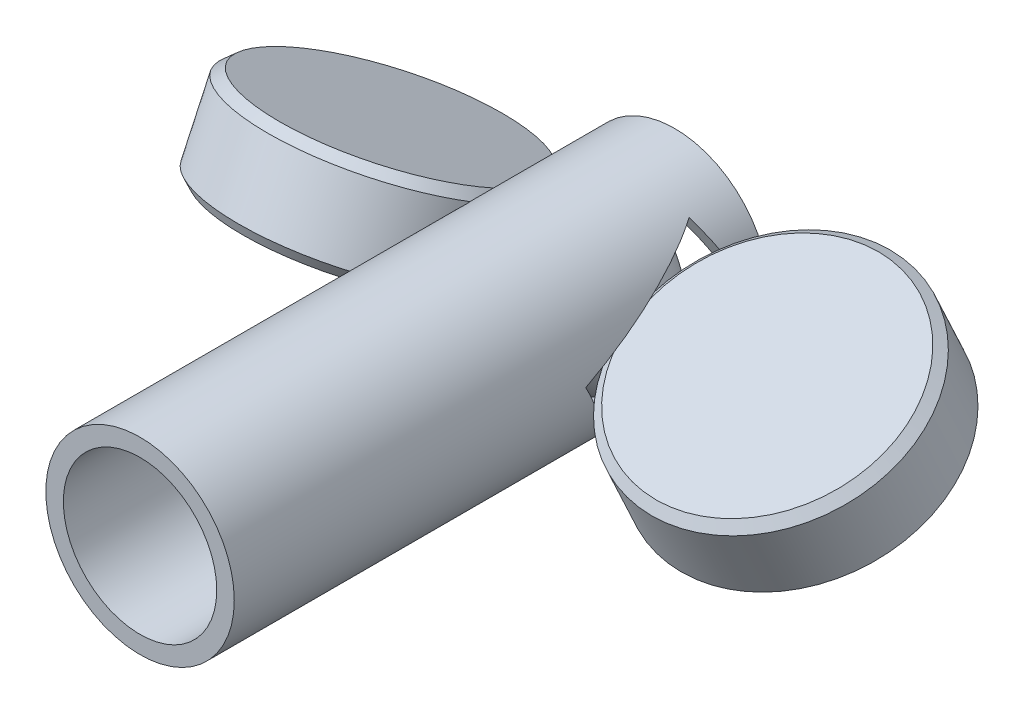
ISO-10303-21;
HEADER;
FILE_DESCRIPTION(('STEP AP214'),'2;1');
FILE_NAME('part.step','',(''),(''),'','','');
FILE_SCHEMA(('AUTOMOTIVE_DESIGN { 1 0 10303 214 1 1 1 1 }'));
ENDSEC;
DATA;
#1=APPLICATION_CONTEXT('core data for automotive mechanical design processes');
#2=APPLICATION_PROTOCOL_DEFINITION('international standard','automotive_design',2000,#1);
#3=PRODUCT_CONTEXT('',#1,'mechanical');
#4=PRODUCT('Part','Part','',(#3));
#5=PRODUCT_RELATED_PRODUCT_CATEGORY('part','',(#4));
#6=PRODUCT_DEFINITION_FORMATION('','',#4);
#7=PRODUCT_DEFINITION_CONTEXT('part definition',#1,'design');
#8=PRODUCT_DEFINITION('design','',#6,#7);
#9=PRODUCT_DEFINITION_SHAPE('','',#8);
#10=(LENGTH_UNIT() NAMED_UNIT(*) SI_UNIT(.MILLI.,.METRE.));
#11=(NAMED_UNIT(*) PLANE_ANGLE_UNIT() SI_UNIT($,.RADIAN.));
#12=(NAMED_UNIT(*) SI_UNIT($,.STERADIAN.) SOLID_ANGLE_UNIT());
#13=UNCERTAINTY_MEASURE_WITH_UNIT(LENGTH_MEASURE(1.E-05),#10,'distance_accuracy_value','');
#14=(GEOMETRIC_REPRESENTATION_CONTEXT(3) GLOBAL_UNCERTAINTY_ASSIGNED_CONTEXT((#13)) GLOBAL_UNIT_ASSIGNED_CONTEXT((#10,
#11,#12)) REPRESENTATION_CONTEXT('',''));
#15=CARTESIAN_POINT('',(0.,0.,0.));
#16=DIRECTION('',(0.,0.,1.));
#17=DIRECTION('',(1.,0.,0.));
#18=AXIS2_PLACEMENT_3D('',#15,#16,#17);
#19=CARTESIAN_POINT('',(0.,0.,-11.));
#20=DIRECTION('',(0.,0.,1.));
#21=DIRECTION('',(1.,0.,0.));
#22=AXIS2_PLACEMENT_3D('',#19,#20,#21);
#23=CYLINDRICAL_SURFACE('',#22,10.75);
#24=CARTESIAN_POINT('',(0.,0.,9.4244760885674));
#25=DIRECTION('',(0.,-0.422618261740701,0.906307787036649));
#26=DIRECTION('',(0.,0.906307787036649,0.422618261740701));
#27=AXIS2_PLACEMENT_3D('',#24,#25,#26);
#28=ELLIPSE('',#27,11.8613126288468,10.75);
#29=CARTESIAN_POINT('',(10.7104093018265,0.921755166705818,9.85429758174627));
#30=VERTEX_POINT('',#29);
#31=CARTESIAN_POINT('',(7.02006870585045,-8.14132270366058,5.62811496433929));
#32=VERTEX_POINT('',#31);
#33=EDGE_CURVE('E121',#30,#32,#28,.F.);
#34=ORIENTED_EDGE('',*,*,#33,.F.);
#35=CARTESIAN_POINT('',(0.,0.,11.8310079157623));
#36=DIRECTION('',(0.,0.906307787036649,0.422618261740701));
#37=DIRECTION('',(0.,-0.422618261740701,0.906307787036649));
#38=AXIS2_PLACEMENT_3D('',#35,#36,#37);
#39=ELLIPSE('',#38,25.4366670188893,10.75);
#40=CARTESIAN_POINT('',(7.02006870585045,8.14132270366058,-5.6281149643393));
#41=VERTEX_POINT('',#40);
#42=EDGE_CURVE('E110',#41,#30,#39,.F.);
#43=ORIENTED_EDGE('',*,*,#42,.F.);
#44=CARTESIAN_POINT('',(0.,0.,-9.4244760885674));
#45=DIRECTION('',(0.,0.422618261740701,-0.906307787036649));
#46=DIRECTION('',(0.,0.906307787036649,0.422618261740701));
#47=AXIS2_PLACEMENT_3D('',#44,#45,#46);
#48=ELLIPSE('',#47,11.8613126288468,10.75);
#49=CARTESIAN_POINT('',(10.7104093018265,-0.921755166705818,-9.85429758174627));
#50=VERTEX_POINT('',#49);
#51=EDGE_CURVE('E115',#50,#41,#48,.F.);
#52=ORIENTED_EDGE('',*,*,#51,.F.);
#53=CARTESIAN_POINT('',(0.,0.,-11.8310079157623));
#54=DIRECTION('',(0.,-0.906307787036649,-0.422618261740701));
#55=DIRECTION('',(0.,-0.422618261740701,0.906307787036649));
#56=AXIS2_PLACEMENT_3D('',#53,#54,#55);
#57=ELLIPSE('',#56,25.4366670188893,10.75);
#58=EDGE_CURVE('E127',#32,#50,#57,.F.);
#59=ORIENTED_EDGE('',*,*,#58,.F.);
#60=EDGE_LOOP('',(#34,#43,#52,#59));
#61=FACE_BOUND('',#60,.T.);
#62=CARTESIAN_POINT('',(0.,0.,-9.4244760885674));
#63=DIRECTION('',(0.,-0.422618261740701,-0.906307787036649));
#64=DIRECTION('',(0.,-0.906307787036649,0.422618261740701));
#65=AXIS2_PLACEMENT_3D('',#62,#63,#64);
#66=ELLIPSE('',#65,11.8613126288468,10.75);
#67=CARTESIAN_POINT('',(-10.7104093018265,0.921755166705818,-9.85429758174627));
#68=VERTEX_POINT('',#67);
#69=CARTESIAN_POINT('',(-7.02006870585045,-8.14132270366058,-5.62811496433929));
#70=VERTEX_POINT('',#69);
#71=EDGE_CURVE('E150',#68,#70,#66,.F.);
#72=ORIENTED_EDGE('',*,*,#71,.F.);
#73=CARTESIAN_POINT('',(0.,0.,-11.8310079157623));
#74=DIRECTION('',(0.,0.906307787036649,-0.422618261740701));
#75=DIRECTION('',(0.,0.422618261740701,0.906307787036649));
#76=AXIS2_PLACEMENT_3D('',#73,#74,#75);
#77=ELLIPSE('',#76,25.4366670188893,10.75);
#78=CARTESIAN_POINT('',(-7.02006870585045,8.14132270366058,5.6281149643393));
#79=VERTEX_POINT('',#78);
#80=EDGE_CURVE('E138',#79,#68,#77,.F.);
#81=ORIENTED_EDGE('',*,*,#80,.F.);
#82=CARTESIAN_POINT('',(0.,0.,9.4244760885674));
#83=DIRECTION('',(0.,0.422618261740701,0.906307787036649));
#84=DIRECTION('',(0.,-0.906307787036649,0.422618261740701));
#85=AXIS2_PLACEMENT_3D('',#82,#83,#84);
#86=ELLIPSE('',#85,11.8613126288468,10.75);
#87=CARTESIAN_POINT('',(-10.7104093018265,-0.921755166705818,9.85429758174627));
#88=VERTEX_POINT('',#87);
#89=EDGE_CURVE('E145',#88,#79,#86,.F.);
#90=ORIENTED_EDGE('',*,*,#89,.F.);
#91=CARTESIAN_POINT('',(0.,0.,11.8310079157623));
#92=DIRECTION('',(0.,-0.906307787036649,0.422618261740701));
#93=DIRECTION('',(0.,0.422618261740701,0.906307787036649));
#94=AXIS2_PLACEMENT_3D('',#91,#92,#93);
#95=ELLIPSE('',#94,25.4366670188893,10.75);
#96=EDGE_CURVE('E148',#70,#88,#95,.F.);
#97=ORIENTED_EDGE('',*,*,#96,.F.);
#98=EDGE_LOOP('',(#72,#81,#90,#97));
#99=FACE_BOUND('',#98,.T.);
#100=CARTESIAN_POINT('',(0.,0.,-11.));
#101=DIRECTION('',(0.,0.,1.));
#102=DIRECTION('',(1.,0.,0.));
#103=AXIS2_PLACEMENT_3D('',#100,#101,#102);
#104=CIRCLE('',#103,10.75);
#105=CARTESIAN_POINT('',(10.75,0.,-11.));
#106=VERTEX_POINT('',#105);
#107=EDGE_CURVE('E161',#106,#106,#104,.T.);
#108=ORIENTED_EDGE('',*,*,#107,.T.);
#109=EDGE_LOOP('',(#108));
#110=FACE_BOUND('',#109,.T.);
#111=CARTESIAN_POINT('',(0.,0.,50.));
#112=DIRECTION('',(0.,0.,1.));
#113=DIRECTION('',(1.,0.,0.));
#114=AXIS2_PLACEMENT_3D('',#111,#112,#113);
#115=CIRCLE('',#114,10.75);
#116=CARTESIAN_POINT('',(10.75,0.,50.));
#117=VERTEX_POINT('',#116);
#118=EDGE_CURVE('E155',#117,#117,#115,.T.);
#119=ORIENTED_EDGE('',*,*,#118,.F.);
#120=EDGE_LOOP('',(#119));
#121=FACE_BOUND('',#120,.T.);
#122=ADVANCED_FACE('F49',(#61,#99,#110,#121),#23,.T.);
#123=CARTESIAN_POINT('',(0.,0.,-11.));
#124=DIRECTION('',(0.,0.,1.));
#125=DIRECTION('',(1.,0.,0.));
#126=AXIS2_PLACEMENT_3D('',#123,#124,#125);
#127=PLANE('',#126);
#128=CARTESIAN_POINT('',(0.,0.,-11.));
#129=DIRECTION('',(0.,0.,1.));
#130=DIRECTION('',(1.,0.,0.));
#131=AXIS2_PLACEMENT_3D('',#128,#129,#130);
#132=CIRCLE('',#131,8.75);
#133=CARTESIAN_POINT('',(8.75,0.,-11.));
#134=VERTEX_POINT('',#133);
#135=EDGE_CURVE('E158',#134,#134,#132,.T.);
#136=ORIENTED_EDGE('',*,*,#135,.T.);
#137=EDGE_LOOP('',(#136));
#138=FACE_BOUND('',#137,.T.);
#139=ORIENTED_EDGE('',*,*,#107,.F.);
#140=EDGE_LOOP('',(#139));
#141=FACE_BOUND('',#140,.T.);
#142=ADVANCED_FACE('F203',(#138,#141),#127,.F.);
#143=CARTESIAN_POINT('',(0.,0.,-11.));
#144=DIRECTION('',(0.,0.,1.));
#145=DIRECTION('',(1.,0.,0.));
#146=AXIS2_PLACEMENT_3D('',#143,#144,#145);
#147=CYLINDRICAL_SURFACE('',#146,8.75);
#148=CARTESIAN_POINT('',(0.,0.,11.8310079157623));
#149=DIRECTION('',(0.,0.906307787036649,0.422618261740701));
#150=DIRECTION('',(0.,-0.422618261740701,0.906307787036649));
#151=AXIS2_PLACEMENT_3D('',#148,#149,#150);
#152=ELLIPSE('',#151,20.7042638525843,8.75);
#153=CARTESIAN_POINT('',(3.20645671027394,8.14132270366058,-5.6281149643393));
#154=VERTEX_POINT('',#153);
#155=CARTESIAN_POINT('',(8.70131411987012,0.921755166705818,9.85429758174627));
#156=VERTEX_POINT('',#155);
#157=EDGE_CURVE('E176',#154,#156,#152,.F.);
#158=ORIENTED_EDGE('',*,*,#157,.T.);
#159=CARTESIAN_POINT('',(0.,0.,9.4244760885674));
#160=DIRECTION('',(0.,-0.422618261740701,0.906307787036649));
#161=DIRECTION('',(0.,0.906307787036649,0.422618261740701));
#162=AXIS2_PLACEMENT_3D('',#159,#160,#161);
#163=ELLIPSE('',#162,9.65455679092181,8.75);
#164=CARTESIAN_POINT('',(3.20645671027394,-8.14132270366058,5.62811496433929));
#165=VERTEX_POINT('',#164);
#166=EDGE_CURVE('E12',#156,#165,#163,.F.);
#167=ORIENTED_EDGE('',*,*,#166,.T.);
#168=CARTESIAN_POINT('',(0.,0.,-11.8310079157623));
#169=DIRECTION('',(0.,-0.906307787036649,-0.422618261740701));
#170=DIRECTION('',(0.,-0.422618261740701,0.906307787036649));
#171=AXIS2_PLACEMENT_3D('',#168,#169,#170);
#172=ELLIPSE('',#171,20.7042638525843,8.75);
#173=CARTESIAN_POINT('',(8.70131411987012,-0.921755166705818,-9.85429758174627));
#174=VERTEX_POINT('',#173);
#175=EDGE_CURVE('E56',#165,#174,#172,.F.);
#176=ORIENTED_EDGE('',*,*,#175,.T.);
#177=CARTESIAN_POINT('',(0.,0.,-9.4244760885674));
#178=DIRECTION('',(0.,0.422618261740701,-0.906307787036649));
#179=DIRECTION('',(0.,0.906307787036649,0.422618261740701));
#180=AXIS2_PLACEMENT_3D('',#177,#178,#179);
#181=ELLIPSE('',#180,9.65455679092181,8.75);
#182=EDGE_CURVE('E178',#174,#154,#181,.F.);
#183=ORIENTED_EDGE('',*,*,#182,.T.);
#184=EDGE_LOOP('',(#158,#167,#176,#183));
#185=FACE_BOUND('',#184,.T.);
#186=CARTESIAN_POINT('',(0.,0.,-11.8310079157623));
#187=DIRECTION('',(0.,0.906307787036649,-0.422618261740701));
#188=DIRECTION('',(0.,0.422618261740701,0.906307787036649));
#189=AXIS2_PLACEMENT_3D('',#186,#187,#188);
#190=ELLIPSE('',#189,20.7042638525843,8.75);
#191=CARTESIAN_POINT('',(-3.20645671027394,8.14132270366058,5.6281149643393));
#192=VERTEX_POINT('',#191);
#193=CARTESIAN_POINT('',(-8.70131411987012,0.921755166705818,-9.85429758174627));
#194=VERTEX_POINT('',#193);
#195=EDGE_CURVE('E164',#192,#194,#190,.F.);
#196=ORIENTED_EDGE('',*,*,#195,.T.);
#197=CARTESIAN_POINT('',(0.,0.,-9.4244760885674));
#198=DIRECTION('',(0.,-0.422618261740701,-0.906307787036649));
#199=DIRECTION('',(0.,-0.906307787036649,0.422618261740701));
#200=AXIS2_PLACEMENT_3D('',#197,#198,#199);
#201=ELLIPSE('',#200,9.65455679092181,8.75);
#202=CARTESIAN_POINT('',(-3.20645671027394,-8.14132270366058,-5.62811496433929));
#203=VERTEX_POINT('',#202);
#204=EDGE_CURVE('E173',#194,#203,#201,.F.);
#205=ORIENTED_EDGE('',*,*,#204,.T.);
#206=CARTESIAN_POINT('',(0.,0.,11.8310079157623));
#207=DIRECTION('',(0.,-0.906307787036649,0.422618261740701));
#208=DIRECTION('',(0.,0.422618261740701,0.906307787036649));
#209=AXIS2_PLACEMENT_3D('',#206,#207,#208);
#210=ELLIPSE('',#209,20.7042638525843,8.75);
#211=CARTESIAN_POINT('',(-8.70131411987012,-0.921755166705818,9.85429758174627));
#212=VERTEX_POINT('',#211);
#213=EDGE_CURVE('E170',#203,#212,#210,.F.);
#214=ORIENTED_EDGE('',*,*,#213,.T.);
#215=CARTESIAN_POINT('',(0.,0.,9.4244760885674));
#216=DIRECTION('',(0.,0.422618261740701,0.906307787036649));
#217=DIRECTION('',(0.,-0.906307787036649,0.422618261740701));
#218=AXIS2_PLACEMENT_3D('',#215,#216,#217);
#219=ELLIPSE('',#218,9.65455679092181,8.75);
#220=EDGE_CURVE('E167',#212,#192,#219,.F.);
#221=ORIENTED_EDGE('',*,*,#220,.T.);
#222=EDGE_LOOP('',(#196,#205,#214,#221));
#223=FACE_BOUND('',#222,.T.);
#224=ORIENTED_EDGE('',*,*,#135,.F.);
#225=EDGE_LOOP('',(#224));
#226=FACE_BOUND('',#225,.T.);
#227=CARTESIAN_POINT('',(0.,0.,50.));
#228=DIRECTION('',(0.,0.,1.));
#229=DIRECTION('',(1.,0.,0.));
#230=AXIS2_PLACEMENT_3D('',#227,#228,#229);
#231=CIRCLE('',#230,8.75);
#232=CARTESIAN_POINT('',(8.75,0.,50.));
#233=VERTEX_POINT('',#232);
#234=EDGE_CURVE('E152',#233,#233,#231,.T.);
#235=ORIENTED_EDGE('',*,*,#234,.T.);
#236=EDGE_LOOP('',(#235));
#237=FACE_BOUND('',#236,.T.);
#238=ADVANCED_FACE('F182',(#185,#223,#226,#237),#147,.F.);
#239=CARTESIAN_POINT('',(0.,0.,50.));
#240=DIRECTION('',(0.,0.,1.));
#241=DIRECTION('',(1.,0.,0.));
#242=AXIS2_PLACEMENT_3D('',#239,#240,#241);
#243=PLANE('',#242);
#244=ORIENTED_EDGE('',*,*,#118,.T.);
#245=EDGE_LOOP('',(#244));
#246=FACE_BOUND('',#245,.T.);
#247=ORIENTED_EDGE('',*,*,#234,.F.);
#248=EDGE_LOOP('',(#247));
#249=FACE_BOUND('',#248,.T.);
#250=ADVANCED_FACE('F211',(#246,#249),#243,.T.);
#251=CARTESIAN_POINT('',(-11.,0.921755166705818,-9.85429758174627));
#252=DIRECTION('',(0.,-0.422618261740701,-0.906307787036649));
#253=DIRECTION('',(0.,0.906307787036649,-0.422618261740701));
#254=AXIS2_PLACEMENT_3D('',#251,#252,#253);
#255=PLANE('',#254);
#256=ORIENTED_EDGE('',*,*,#71,.T.);
#257=DIRECTION('',(1.,0.,0.));
#258=VECTOR('',#257,1.);
#259=CARTESIAN_POINT('',(-11.,-8.14132270366058,-5.62811496433929));
#260=LINE('',#259,#258);
#261=EDGE_CURVE('E135',#70,#203,#260,.T.);
#262=ORIENTED_EDGE('',*,*,#261,.T.);
#263=ORIENTED_EDGE('',*,*,#204,.F.);
#264=DIRECTION('',(1.,0.,0.));
#265=VECTOR('',#264,1.);
#266=CARTESIAN_POINT('',(-11.,0.921755166705818,-9.85429758174627));
#267=LINE('',#266,#265);
#268=EDGE_CURVE('E128',#68,#194,#267,.T.);
#269=ORIENTED_EDGE('',*,*,#268,.F.);
#270=EDGE_LOOP('',(#256,#262,#263,#269));
#271=FACE_BOUND('',#270,.T.);
#272=ADVANCED_FACE('F217',(#271),#255,.F.);
#273=CARTESIAN_POINT('',(-11.,-8.14132270366058,-5.62811496433929));
#274=DIRECTION('',(0.,-0.906307787036649,0.422618261740701));
#275=DIRECTION('',(0.,-0.422618261740701,-0.906307787036649));
#276=AXIS2_PLACEMENT_3D('',#273,#274,#275);
#277=PLANE('',#276);
#278=ORIENTED_EDGE('',*,*,#96,.T.);
#279=DIRECTION('',(1.,0.,0.));
#280=VECTOR('',#279,1.);
#281=CARTESIAN_POINT('',(-11.,-0.921755166705818,9.85429758174627));
#282=LINE('',#281,#280);
#283=EDGE_CURVE('E139',#88,#212,#282,.T.);
#284=ORIENTED_EDGE('',*,*,#283,.T.);
#285=ORIENTED_EDGE('',*,*,#213,.F.);
#286=ORIENTED_EDGE('',*,*,#261,.F.);
#287=EDGE_LOOP('',(#278,#284,#285,#286));
#288=FACE_BOUND('',#287,.T.);
#289=ADVANCED_FACE('F221',(#288),#277,.F.);
#290=CARTESIAN_POINT('',(-11.,8.14132270366058,5.6281149643393));
#291=DIRECTION('',(0.,0.422618261740701,0.906307787036649));
#292=DIRECTION('',(0.,-0.906307787036649,0.422618261740701));
#293=AXIS2_PLACEMENT_3D('',#290,#291,#292);
#294=PLANE('',#293);
#295=ORIENTED_EDGE('',*,*,#89,.T.);
#296=DIRECTION('',(1.,0.,0.));
#297=VECTOR('',#296,1.);
#298=CARTESIAN_POINT('',(-11.,8.14132270366058,5.6281149643393));
#299=LINE('',#298,#297);
#300=EDGE_CURVE('E130',#79,#192,#299,.T.);
#301=ORIENTED_EDGE('',*,*,#300,.T.);
#302=ORIENTED_EDGE('',*,*,#220,.F.);
#303=ORIENTED_EDGE('',*,*,#283,.F.);
#304=EDGE_LOOP('',(#295,#301,#302,#303));
#305=FACE_BOUND('',#304,.T.);
#306=ADVANCED_FACE('F226',(#305),#294,.F.);
#307=CARTESIAN_POINT('',(-11.,0.921755166705818,-9.85429758174627));
#308=DIRECTION('',(0.,0.906307787036649,-0.422618261740701));
#309=DIRECTION('',(0.,0.422618261740701,0.906307787036649));
#310=AXIS2_PLACEMENT_3D('',#307,#308,#309);
#311=PLANE('',#310);
#312=ORIENTED_EDGE('',*,*,#80,.T.);
#313=ORIENTED_EDGE('',*,*,#268,.T.);
#314=ORIENTED_EDGE('',*,*,#195,.F.);
#315=ORIENTED_EDGE('',*,*,#300,.F.);
#316=EDGE_LOOP('',(#312,#313,#314,#315));
#317=FACE_BOUND('',#316,.T.);
#318=ADVANCED_FACE('F223',(#317),#311,.F.);
#319=CARTESIAN_POINT('',(11.1666768412559,0.921755166705818,9.85429758174627));
#320=DIRECTION('',(0.,-0.422618261740701,0.906307787036649));
#321=DIRECTION('',(0.,-0.906307787036649,-0.422618261740701));
#322=AXIS2_PLACEMENT_3D('',#319,#320,#321);
#323=PLANE('',#322);
#324=ORIENTED_EDGE('',*,*,#33,.T.);
#325=DIRECTION('',(-1.,0.,0.));
#326=VECTOR('',#325,1.);
#327=CARTESIAN_POINT('',(11.1666768412559,-8.14132270366058,5.62811496433929));
#328=LINE('',#327,#326);
#329=EDGE_CURVE('E116',#32,#165,#328,.T.);
#330=ORIENTED_EDGE('',*,*,#329,.T.);
#331=ORIENTED_EDGE('',*,*,#166,.F.);
#332=DIRECTION('',(-1.,0.,0.));
#333=VECTOR('',#332,1.);
#334=CARTESIAN_POINT('',(11.1666768412559,0.921755166705818,9.85429758174627));
#335=LINE('',#334,#333);
#336=EDGE_CURVE('E68',#30,#156,#335,.T.);
#337=ORIENTED_EDGE('',*,*,#336,.F.);
#338=EDGE_LOOP('',(#324,#330,#331,#337));
#339=FACE_BOUND('',#338,.T.);
#340=ADVANCED_FACE('F119',(#339),#323,.F.);
#341=CARTESIAN_POINT('',(11.1666768412559,-8.14132270366058,5.62811496433929));
#342=DIRECTION('',(0.,-0.906307787036649,-0.422618261740701));
#343=DIRECTION('',(0.,0.422618261740701,-0.906307787036649));
#344=AXIS2_PLACEMENT_3D('',#341,#342,#343);
#345=PLANE('',#344);
#346=ORIENTED_EDGE('',*,*,#58,.T.);
#347=DIRECTION('',(-1.,0.,0.));
#348=VECTOR('',#347,1.);
#349=CARTESIAN_POINT('',(11.1666768412559,-0.921755166705818,-9.85429758174627));
#350=LINE('',#349,#348);
#351=EDGE_CURVE('E188',#50,#174,#350,.T.);
#352=ORIENTED_EDGE('',*,*,#351,.T.);
#353=ORIENTED_EDGE('',*,*,#175,.F.);
#354=ORIENTED_EDGE('',*,*,#329,.F.);
#355=EDGE_LOOP('',(#346,#352,#353,#354));
#356=FACE_BOUND('',#355,.T.);
#357=ADVANCED_FACE('F186',(#356),#345,.F.);
#358=CARTESIAN_POINT('',(11.1666768412559,8.14132270366058,-5.6281149643393));
#359=DIRECTION('',(0.,0.422618261740701,-0.906307787036649));
#360=DIRECTION('',(0.,0.906307787036649,0.422618261740701));
#361=AXIS2_PLACEMENT_3D('',#358,#359,#360);
#362=PLANE('',#361);
#363=ORIENTED_EDGE('',*,*,#51,.T.);
#364=DIRECTION('',(-1.,0.,0.));
#365=VECTOR('',#364,1.);
#366=CARTESIAN_POINT('',(11.1666768412559,8.14132270366058,-5.6281149643393));
#367=LINE('',#366,#365);
#368=EDGE_CURVE('E63',#41,#154,#367,.T.);
#369=ORIENTED_EDGE('',*,*,#368,.T.);
#370=ORIENTED_EDGE('',*,*,#182,.F.);
#371=ORIENTED_EDGE('',*,*,#351,.F.);
#372=EDGE_LOOP('',(#363,#369,#370,#371));
#373=FACE_BOUND('',#372,.T.);
#374=ADVANCED_FACE('F193',(#373),#362,.F.);
#375=CARTESIAN_POINT('',(11.1666768412559,0.921755166705818,9.85429758174627));
#376=DIRECTION('',(0.,0.906307787036649,0.422618261740701));
#377=DIRECTION('',(0.,-0.422618261740701,0.906307787036649));
#378=AXIS2_PLACEMENT_3D('',#375,#376,#377);
#379=PLANE('',#378);
#380=ORIENTED_EDGE('',*,*,#42,.T.);
#381=ORIENTED_EDGE('',*,*,#336,.T.);
#382=ORIENTED_EDGE('',*,*,#157,.F.);
#383=ORIENTED_EDGE('',*,*,#368,.F.);
#384=EDGE_LOOP('',(#380,#381,#382,#383));
#385=FACE_BOUND('',#384,.T.);
#386=ADVANCED_FACE('F111',(#385),#379,.F.);
#387=CLOSED_SHELL('',(#122,#142,#238,#250,#272,#289,#306,#318,#340,#357,#374,#386));
#388=MANIFOLD_SOLID_BREP('B2',#387);
#389=CARTESIAN_POINT('',(23.5,-4.53153893518325,-2.27976814995925));
#390=DIRECTION('',(0.,-0.906307787036649,-0.422618261740701));
#391=DIRECTION('',(0.,-0.422618261740701,0.906307787036649));
#392=AXIS2_PLACEMENT_3D('',#389,#390,#391);
#393=PLANE('',#392);
#394=CARTESIAN_POINT('',(23.5,-4.53153893518325,-2.27976814995925));
#395=DIRECTION('',(0.,-0.906307787036649,-0.422618261740701));
#396=DIRECTION('',(0.,-0.422618261740701,0.906307787036649));
#397=AXIS2_PLACEMENT_3D('',#394,#395,#396);
#398=CIRCLE('',#397,13.999999999791);
#399=CARTESIAN_POINT('',(23.5,-10.4481945994647,10.4085408683644));
#400=VERTEX_POINT('',#399);
#401=EDGE_CURVE('E336',#400,#400,#398,.T.);
#402=ORIENTED_EDGE('',*,*,#401,.T.);
#403=EDGE_LOOP('',(#402));
#404=FACE_BOUND('',#403,.T.);
#405=ADVANCED_FACE('F329',(#404),#393,.T.);
#406=CARTESIAN_POINT('',(23.5,4.53153893499382,1.94641446735943));
#407=DIRECTION('',(0.,0.906307787036649,0.422618261740701));
#408=DIRECTION('',(0.,0.422618261740701,-0.906307787036649));
#409=AXIS2_PLACEMENT_3D('',#406,#407,#408);
#410=CYLINDRICAL_SURFACE('',#409,15.);
#411=CARTESIAN_POINT('',(23.5,-3.62523114795718,-1.85714988813022));
#412=DIRECTION('',(0.,-0.906307787036649,-0.422618261740701));
#413=DIRECTION('',(0.,-0.422618261740701,0.906307787036649));
#414=AXIS2_PLACEMENT_3D('',#411,#412,#413);
#415=CIRCLE('',#414,15.);
#416=CARTESIAN_POINT('',(23.5,-9.96450507406769,11.7374669174195));
#417=VERTEX_POINT('',#416);
#418=EDGE_CURVE('E340',#417,#417,#415,.F.);
#419=ORIENTED_EDGE('',*,*,#418,.T.);
#420=EDGE_LOOP('',(#419));
#421=FACE_BOUND('',#420,.T.);
#422=CARTESIAN_POINT('',(23.5,3.62523114795718,1.52379620561873));
#423=DIRECTION('',(0.,0.906307787036649,0.422618261740701));
#424=DIRECTION('',(0.,0.422618261740701,-0.906307787036649));
#425=AXIS2_PLACEMENT_3D('',#422,#423,#424);
#426=CIRCLE('',#425,15.);
#427=CARTESIAN_POINT('',(23.5,9.9645050740677,-12.070820599931));
#428=VERTEX_POINT('',#427);
#429=EDGE_CURVE('E344',#428,#428,#426,.F.);
#430=ORIENTED_EDGE('',*,*,#429,.T.);
#431=EDGE_LOOP('',(#430));
#432=FACE_BOUND('',#431,.T.);
#433=ADVANCED_FACE('F350',(#421,#432),#410,.T.);
#434=CARTESIAN_POINT('',(23.5,4.53153893499382,1.94641446735943));
#435=DIRECTION('',(0.,0.906307787036649,0.422618261740701));
#436=DIRECTION('',(0.,0.422618261740701,-0.906307787036649));
#437=AXIS2_PLACEMENT_3D('',#434,#435,#436);
#438=PLANE('',#437);
#439=CARTESIAN_POINT('',(23.5,4.53153893499382,1.94641446735943));
#440=DIRECTION('',(0.,0.906307787036649,0.422618261740701));
#441=DIRECTION('',(0.,0.422618261740701,-0.906307787036649));
#442=AXIS2_PLACEMENT_3D('',#439,#440,#441);
#443=CIRCLE('',#442,14.);
#444=CARTESIAN_POINT('',(23.5,10.4481945993636,-10.7418945511537));
#445=VERTEX_POINT('',#444);
#446=EDGE_CURVE('E48',#445,#445,#443,.T.);
#447=ORIENTED_EDGE('',*,*,#446,.T.);
#448=EDGE_LOOP('',(#447));
#449=FACE_BOUND('',#448,.T.);
#450=ADVANCED_FACE('F358',(#449),#438,.T.);
#451=CARTESIAN_POINT('',(23.5,-3.62523114795718,-1.85714988813022));
#452=DIRECTION('',(0.,0.906307787036649,0.422618261740701));
#453=DIRECTION('',(0.,0.422618261740701,-0.906307787036649));
#454=AXIS2_PLACEMENT_3D('',#451,#452,#453);
#455=CONICAL_SURFACE('',#454,15.,0.78539816339745);
#456=ORIENTED_EDGE('',*,*,#401,.F.);
#457=EDGE_LOOP('',(#456));
#458=FACE_BOUND('',#457,.T.);
#459=ORIENTED_EDGE('',*,*,#418,.F.);
#460=EDGE_LOOP('',(#459));
#461=FACE_BOUND('',#460,.T.);
#462=ADVANCED_FACE('F354',(#458,#461),#455,.T.);
#463=CARTESIAN_POINT('',(23.5,4.53153893499382,1.94641446735943));
#464=DIRECTION('',(0.,-0.906307787036649,-0.422618261740701));
#465=DIRECTION('',(0.,-0.422618261740701,0.906307787036649));
#466=AXIS2_PLACEMENT_3D('',#463,#464,#465);
#467=CONICAL_SURFACE('',#466,14.,0.785398163397448);
#468=ORIENTED_EDGE('',*,*,#429,.F.);
#469=EDGE_LOOP('',(#468));
#470=FACE_BOUND('',#469,.T.);
#471=ORIENTED_EDGE('',*,*,#446,.F.);
#472=EDGE_LOOP('',(#471));
#473=FACE_BOUND('',#472,.T.);
#474=ADVANCED_FACE('F331',(#470,#473),#467,.T.);
#475=CLOSED_SHELL('',(#405,#433,#450,#462,#474));
#476=MANIFOLD_SOLID_BREP('B6',#475);
#477=CARTESIAN_POINT('',(-23.5,-4.53153893518325,2.11309130870338));
#478=DIRECTION('',(0.,-0.906307787036649,0.422618261740701));
#479=DIRECTION('',(0.,-0.422618261740701,-0.906307787036649));
#480=AXIS2_PLACEMENT_3D('',#477,#478,#479);
#481=PLANE('',#480);
#482=CARTESIAN_POINT('',(-23.5,-4.53153893518325,2.11309130870338));
#483=DIRECTION('',(0.,-0.906307787036649,0.422618261740701));
#484=DIRECTION('',(0.,-0.422618261740701,-0.906307787036649));
#485=AXIS2_PLACEMENT_3D('',#482,#483,#484);
#486=CIRCLE('',#485,13.999999999791);
#487=CARTESIAN_POINT('',(-23.5,-10.4481945994647,-10.5752177096203));
#488=VERTEX_POINT('',#487);
#489=EDGE_CURVE('E411',#488,#488,#486,.T.);
#490=ORIENTED_EDGE('',*,*,#489,.T.);
#491=EDGE_LOOP('',(#490));
#492=FACE_BOUND('',#491,.T.);
#493=ADVANCED_FACE('F404',(#492),#481,.T.);
#494=CARTESIAN_POINT('',(-23.5,4.53153893499382,-2.1130913086153));
#495=DIRECTION('',(0.,0.906307787036649,-0.422618261740701));
#496=DIRECTION('',(0.,0.422618261740701,0.906307787036649));
#497=AXIS2_PLACEMENT_3D('',#494,#495,#496);
#498=CYLINDRICAL_SURFACE('',#497,15.);
#499=CARTESIAN_POINT('',(-23.5,-3.62523114795718,1.69047304687435));
#500=DIRECTION('',(0.,-0.906307787036649,0.422618261740701));
#501=DIRECTION('',(0.,-0.422618261740701,-0.906307787036649));
#502=AXIS2_PLACEMENT_3D('',#499,#500,#501);
#503=CIRCLE('',#502,15.);
#504=CARTESIAN_POINT('',(-23.5,-9.96450507406769,-11.9041437586754));
#505=VERTEX_POINT('',#504);
#506=EDGE_CURVE('E415',#505,#505,#503,.F.);
#507=ORIENTED_EDGE('',*,*,#506,.T.);
#508=EDGE_LOOP('',(#507));
#509=FACE_BOUND('',#508,.T.);
#510=CARTESIAN_POINT('',(-23.5,3.62523114795718,-1.69047304687461));
#511=DIRECTION('',(0.,0.906307787036649,-0.422618261740701));
#512=DIRECTION('',(0.,0.422618261740701,0.906307787036649));
#513=AXIS2_PLACEMENT_3D('',#510,#511,#512);
#514=CIRCLE('',#513,15.);
#515=CARTESIAN_POINT('',(-23.5,9.9645050740677,11.9041437586751));
#516=VERTEX_POINT('',#515);
#517=EDGE_CURVE('E419',#516,#516,#514,.F.);
#518=ORIENTED_EDGE('',*,*,#517,.T.);
#519=EDGE_LOOP('',(#518));
#520=FACE_BOUND('',#519,.T.);
#521=ADVANCED_FACE('F425',(#509,#520),#498,.T.);
#522=CARTESIAN_POINT('',(-23.5,4.53153893499382,-2.1130913086153));
#523=DIRECTION('',(0.,0.906307787036649,-0.422618261740701));
#524=DIRECTION('',(0.,0.422618261740701,0.906307787036649));
#525=AXIS2_PLACEMENT_3D('',#522,#523,#524);
#526=PLANE('',#525);
#527=CARTESIAN_POINT('',(-23.5,4.53153893499382,-2.1130913086153));
#528=DIRECTION('',(0.,0.906307787036649,-0.422618261740701));
#529=DIRECTION('',(0.,0.422618261740701,0.906307787036649));
#530=AXIS2_PLACEMENT_3D('',#527,#528,#529);
#531=CIRCLE('',#530,14.);
#532=CARTESIAN_POINT('',(-23.5,10.4481945993636,10.5752177098978));
#533=VERTEX_POINT('',#532);
#534=EDGE_CURVE('E328',#533,#533,#531,.T.);
#535=ORIENTED_EDGE('',*,*,#534,.T.);
#536=EDGE_LOOP('',(#535));
#537=FACE_BOUND('',#536,.T.);
#538=ADVANCED_FACE('F433',(#537),#526,.T.);
#539=CARTESIAN_POINT('',(-23.5,-3.62523114795718,1.69047304687435));
#540=DIRECTION('',(0.,0.906307787036649,-0.422618261740701));
#541=DIRECTION('',(0.,0.422618261740701,0.906307787036649));
#542=AXIS2_PLACEMENT_3D('',#539,#540,#541);
#543=CONICAL_SURFACE('',#542,15.,0.78539816339745);
#544=ORIENTED_EDGE('',*,*,#489,.F.);
#545=EDGE_LOOP('',(#544));
#546=FACE_BOUND('',#545,.T.);
#547=ORIENTED_EDGE('',*,*,#506,.F.);
#548=EDGE_LOOP('',(#547));
#549=FACE_BOUND('',#548,.T.);
#550=ADVANCED_FACE('F429',(#546,#549),#543,.T.);
#551=CARTESIAN_POINT('',(-23.5,4.53153893499382,-2.1130913086153));
#552=DIRECTION('',(0.,-0.906307787036649,0.422618261740701));
#553=DIRECTION('',(0.,-0.422618261740701,-0.906307787036649));
#554=AXIS2_PLACEMENT_3D('',#551,#552,#553);
#555=CONICAL_SURFACE('',#554,14.,0.785398163397448);
#556=ORIENTED_EDGE('',*,*,#517,.F.);
#557=EDGE_LOOP('',(#556));
#558=FACE_BOUND('',#557,.T.);
#559=ORIENTED_EDGE('',*,*,#534,.F.);
#560=EDGE_LOOP('',(#559));
#561=FACE_BOUND('',#560,.T.);
#562=ADVANCED_FACE('F406',(#558,#561),#555,.T.);
#563=CLOSED_SHELL('',(#493,#521,#538,#550,#562));
#564=MANIFOLD_SOLID_BREP('B43',#563);
#565=CARTESIAN_POINT('',(0.,0.,0.));
#566=DIRECTION('',(0.,1.,0.));
#567=DIRECTION('',(1.,0.,0.));
#568=AXIS2_PLACEMENT_3D('',#565,#566,#567);
#569=SPHERICAL_SURFACE('',#568,8.5);
#570=CARTESIAN_POINT('',(0.,8.5,0.));
#571=VERTEX_POINT('',#570);
#572=VERTEX_LOOP('',#571);
#573=FACE_BOUND('',#572,.T.);
#574=ADVANCED_FACE('F475',(#573),#569,.T.);
#575=CLOSED_SHELL('',(#574));
#576=MANIFOLD_SOLID_BREP('B323',#575);
#577=ADVANCED_BREP_SHAPE_REPRESENTATION('',(#18,#388,#476,#564,#576),#14);
#578=SHAPE_DEFINITION_REPRESENTATION(#9,#577);
ENDSEC;
END-ISO-10303-21;
